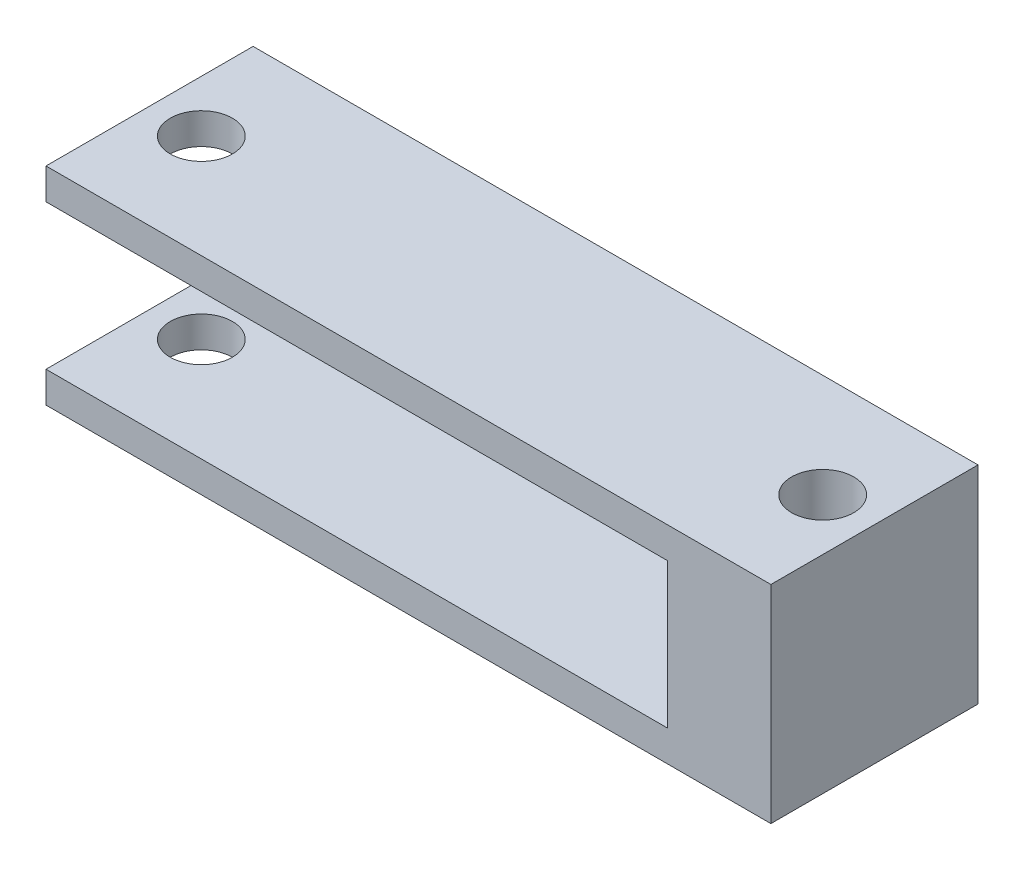
ISO-10303-21;
HEADER;
FILE_DESCRIPTION(('STEP AP214'),'2;1');
FILE_NAME('part.step','',(''),(''),'','','');
FILE_SCHEMA(('AUTOMOTIVE_DESIGN { 1 0 10303 214 1 1 1 1 }'));
ENDSEC;
DATA;
#1=APPLICATION_CONTEXT('core data for automotive mechanical design processes');
#2=APPLICATION_PROTOCOL_DEFINITION('international standard','automotive_design',2000,#1);
#3=PRODUCT_CONTEXT('',#1,'mechanical');
#4=PRODUCT('Part','Part','',(#3));
#5=PRODUCT_RELATED_PRODUCT_CATEGORY('part','',(#4));
#6=PRODUCT_DEFINITION_FORMATION('','',#4);
#7=PRODUCT_DEFINITION_CONTEXT('part definition',#1,'design');
#8=PRODUCT_DEFINITION('design','',#6,#7);
#9=PRODUCT_DEFINITION_SHAPE('','',#8);
#10=(LENGTH_UNIT() NAMED_UNIT(*) SI_UNIT(.MILLI.,.METRE.));
#11=(NAMED_UNIT(*) PLANE_ANGLE_UNIT() SI_UNIT($,.RADIAN.));
#12=(NAMED_UNIT(*) SI_UNIT($,.STERADIAN.) SOLID_ANGLE_UNIT());
#13=UNCERTAINTY_MEASURE_WITH_UNIT(LENGTH_MEASURE(1.E-05),#10,'distance_accuracy_value','');
#14=(GEOMETRIC_REPRESENTATION_CONTEXT(3) GLOBAL_UNCERTAINTY_ASSIGNED_CONTEXT((#13)) GLOBAL_UNIT_ASSIGNED_CONTEXT((#10,
#11,#12)) REPRESENTATION_CONTEXT('',''));
#15=CARTESIAN_POINT('',(0.,0.,0.));
#16=DIRECTION('',(0.,0.,1.));
#17=DIRECTION('',(1.,0.,0.));
#18=AXIS2_PLACEMENT_3D('',#15,#16,#17);
#19=CARTESIAN_POINT('',(-17.5,10.,-5.));
#20=DIRECTION('',(1.,0.,0.));
#21=DIRECTION('',(0.,0.,-1.));
#22=AXIS2_PLACEMENT_3D('',#19,#20,#21);
#23=PLANE('',#22);
#24=DIRECTION('',(0.,-1.,0.));
#25=VECTOR('',#24,1.);
#26=CARTESIAN_POINT('',(-17.5,10.,-5.));
#27=LINE('',#26,#25);
#28=CARTESIAN_POINT('',(-17.5,10.,-5.));
#29=VERTEX_POINT('',#28);
#30=CARTESIAN_POINT('',(-17.5,8.5,-5.));
#31=VERTEX_POINT('',#30);
#32=EDGE_CURVE('E55',#29,#31,#27,.T.);
#33=ORIENTED_EDGE('',*,*,#32,.T.);
#34=DIRECTION('',(0.,0.,1.));
#35=VECTOR('',#34,1.);
#36=CARTESIAN_POINT('',(-17.5,8.5,-5.));
#37=LINE('',#36,#35);
#38=CARTESIAN_POINT('',(-17.5,8.5,5.));
#39=VERTEX_POINT('',#38);
#40=EDGE_CURVE('E161',#31,#39,#37,.T.);
#41=ORIENTED_EDGE('',*,*,#40,.T.);
#42=DIRECTION('',(0.,-1.,0.));
#43=VECTOR('',#42,1.);
#44=CARTESIAN_POINT('',(-17.5,10.,5.));
#45=LINE('',#44,#43);
#46=CARTESIAN_POINT('',(-17.5,10.,5.));
#47=VERTEX_POINT('',#46);
#48=EDGE_CURVE('E208',#47,#39,#45,.T.);
#49=ORIENTED_EDGE('',*,*,#48,.F.);
#50=DIRECTION('',(0.,0.,1.));
#51=VECTOR('',#50,1.);
#52=CARTESIAN_POINT('',(-17.5,10.,-5.));
#53=LINE('',#52,#51);
#54=EDGE_CURVE('E187',#29,#47,#53,.T.);
#55=ORIENTED_EDGE('',*,*,#54,.F.);
#56=EDGE_LOOP('',(#33,#41,#49,#55));
#57=FACE_BOUND('',#56,.T.);
#58=ADVANCED_FACE('F45',(#57),#23,.F.);
#59=CARTESIAN_POINT('',(-15.,10.,0.));
#60=DIRECTION('',(0.,-1.,0.));
#61=DIRECTION('',(0.,0.,-1.));
#62=AXIS2_PLACEMENT_3D('',#59,#60,#61);
#63=CYLINDRICAL_SURFACE('',#62,1.5);
#64=CARTESIAN_POINT('',(-15.,8.5,0.));
#65=DIRECTION('',(0.,1.,0.));
#66=DIRECTION('',(-1.,0.,0.));
#67=AXIS2_PLACEMENT_3D('',#64,#65,#66);
#68=CIRCLE('',#67,1.5);
#69=CARTESIAN_POINT('',(-16.5,8.5,0.));
#70=VERTEX_POINT('',#69);
#71=EDGE_CURVE('E49',#70,#70,#68,.T.);
#72=ORIENTED_EDGE('',*,*,#71,.F.);
#73=EDGE_LOOP('',(#72));
#74=FACE_BOUND('',#73,.T.);
#75=CARTESIAN_POINT('',(-15.,10.,0.));
#76=DIRECTION('',(0.,1.,0.));
#77=DIRECTION('',(0.,0.,1.));
#78=AXIS2_PLACEMENT_3D('',#75,#76,#77);
#79=CIRCLE('',#78,1.5);
#80=CARTESIAN_POINT('',(-15.,10.,1.5));
#81=VERTEX_POINT('',#80);
#82=EDGE_CURVE('E174',#81,#81,#79,.T.);
#83=ORIENTED_EDGE('',*,*,#82,.T.);
#84=EDGE_LOOP('',(#83));
#85=FACE_BOUND('',#84,.T.);
#86=ADVANCED_FACE('F225',(#74,#85),#63,.F.);
#87=CARTESIAN_POINT('',(0.,10.,0.));
#88=DIRECTION('',(0.,1.,0.));
#89=DIRECTION('',(0.,0.,1.));
#90=AXIS2_PLACEMENT_3D('',#87,#88,#89);
#91=PLANE('',#90);
#92=ORIENTED_EDGE('',*,*,#82,.F.);
#93=EDGE_LOOP('',(#92));
#94=FACE_BOUND('',#93,.T.);
#95=DIRECTION('',(0.,0.,-1.));
#96=VECTOR('',#95,1.);
#97=CARTESIAN_POINT('',(17.5,10.,-5.));
#98=LINE('',#97,#96);
#99=CARTESIAN_POINT('',(17.5,10.,5.));
#100=VERTEX_POINT('',#99);
#101=CARTESIAN_POINT('',(17.5,10.,-5.));
#102=VERTEX_POINT('',#101);
#103=EDGE_CURVE('E182',#100,#102,#98,.T.);
#104=ORIENTED_EDGE('',*,*,#103,.T.);
#105=DIRECTION('',(-1.,0.,0.));
#106=VECTOR('',#105,1.);
#107=CARTESIAN_POINT('',(-17.5,10.,-5.));
#108=LINE('',#107,#106);
#109=EDGE_CURVE('E99',#102,#29,#108,.T.);
#110=ORIENTED_EDGE('',*,*,#109,.T.);
#111=ORIENTED_EDGE('',*,*,#54,.T.);
#112=DIRECTION('',(1.,0.,0.));
#113=VECTOR('',#112,1.);
#114=CARTESIAN_POINT('',(-17.5,10.,5.));
#115=LINE('',#114,#113);
#116=EDGE_CURVE('E72',#47,#100,#115,.T.);
#117=ORIENTED_EDGE('',*,*,#116,.T.);
#118=EDGE_LOOP('',(#104,#110,#111,#117));
#119=FACE_BOUND('',#118,.T.);
#120=CARTESIAN_POINT('',(15.,10.,0.));
#121=DIRECTION('',(0.,1.,0.));
#122=DIRECTION('',(0.,0.,1.));
#123=AXIS2_PLACEMENT_3D('',#120,#121,#122);
#124=CIRCLE('',#123,1.5);
#125=CARTESIAN_POINT('',(15.,10.,1.5));
#126=VERTEX_POINT('',#125);
#127=EDGE_CURVE('E166',#126,#126,#124,.T.);
#128=ORIENTED_EDGE('',*,*,#127,.F.);
#129=EDGE_LOOP('',(#128));
#130=FACE_BOUND('',#129,.T.);
#131=ADVANCED_FACE('F231',(#94,#119,#130),#91,.T.);
#132=CARTESIAN_POINT('',(0.,0.,0.));
#133=DIRECTION('',(0.,1.,0.));
#134=DIRECTION('',(0.,0.,1.));
#135=AXIS2_PLACEMENT_3D('',#132,#133,#134);
#136=PLANE('',#135);
#137=DIRECTION('',(0.,0.,-1.));
#138=VECTOR('',#137,1.);
#139=CARTESIAN_POINT('',(17.5,0.,-5.));
#140=LINE('',#139,#138);
#141=CARTESIAN_POINT('',(17.5,0.,5.));
#142=VERTEX_POINT('',#141);
#143=CARTESIAN_POINT('',(17.5,0.,-5.));
#144=VERTEX_POINT('',#143);
#145=EDGE_CURVE('E178',#142,#144,#140,.T.);
#146=ORIENTED_EDGE('',*,*,#145,.F.);
#147=DIRECTION('',(1.,0.,0.));
#148=VECTOR('',#147,1.);
#149=CARTESIAN_POINT('',(-17.5,0.,5.));
#150=LINE('',#149,#148);
#151=CARTESIAN_POINT('',(-17.5,0.,5.));
#152=VERTEX_POINT('',#151);
#153=EDGE_CURVE('E92',#152,#142,#150,.T.);
#154=ORIENTED_EDGE('',*,*,#153,.F.);
#155=DIRECTION('',(0.,0.,1.));
#156=VECTOR('',#155,1.);
#157=CARTESIAN_POINT('',(-17.5,0.,-5.));
#158=LINE('',#157,#156);
#159=CARTESIAN_POINT('',(-17.5,0.,-5.));
#160=VERTEX_POINT('',#159);
#161=EDGE_CURVE('E199',#160,#152,#158,.T.);
#162=ORIENTED_EDGE('',*,*,#161,.F.);
#163=DIRECTION('',(-1.,0.,0.));
#164=VECTOR('',#163,1.);
#165=CARTESIAN_POINT('',(-17.5,0.,-5.));
#166=LINE('',#165,#164);
#167=EDGE_CURVE('E196',#144,#160,#166,.T.);
#168=ORIENTED_EDGE('',*,*,#167,.F.);
#169=EDGE_LOOP('',(#146,#154,#162,#168));
#170=FACE_BOUND('',#169,.T.);
#171=CARTESIAN_POINT('',(-15.,0.,0.));
#172=DIRECTION('',(0.,1.,0.));
#173=DIRECTION('',(0.,0.,1.));
#174=AXIS2_PLACEMENT_3D('',#171,#172,#173);
#175=CIRCLE('',#174,1.5);
#176=CARTESIAN_POINT('',(-15.,0.,1.5));
#177=VERTEX_POINT('',#176);
#178=EDGE_CURVE('E170',#177,#177,#175,.T.);
#179=ORIENTED_EDGE('',*,*,#178,.T.);
#180=EDGE_LOOP('',(#179));
#181=FACE_BOUND('',#180,.T.);
#182=CARTESIAN_POINT('',(15.,0.,0.));
#183=DIRECTION('',(0.,1.,0.));
#184=DIRECTION('',(0.,0.,1.));
#185=AXIS2_PLACEMENT_3D('',#182,#183,#184);
#186=CIRCLE('',#185,1.5);
#187=CARTESIAN_POINT('',(15.,0.,1.5));
#188=VERTEX_POINT('',#187);
#189=EDGE_CURVE('E165',#188,#188,#186,.T.);
#190=ORIENTED_EDGE('',*,*,#189,.T.);
#191=EDGE_LOOP('',(#190));
#192=FACE_BOUND('',#191,.T.);
#193=ADVANCED_FACE('F228',(#170,#181,#192),#136,.F.);
#194=CARTESIAN_POINT('',(17.5,10.,-5.));
#195=DIRECTION('',(-1.,0.,0.));
#196=DIRECTION('',(0.,0.,1.));
#197=AXIS2_PLACEMENT_3D('',#194,#195,#196);
#198=PLANE('',#197);
#199=ORIENTED_EDGE('',*,*,#145,.T.);
#200=DIRECTION('',(0.,-1.,0.));
#201=VECTOR('',#200,1.);
#202=CARTESIAN_POINT('',(17.5,10.,-5.));
#203=LINE('',#202,#201);
#204=EDGE_CURVE('E11',#102,#144,#203,.T.);
#205=ORIENTED_EDGE('',*,*,#204,.F.);
#206=ORIENTED_EDGE('',*,*,#103,.F.);
#207=DIRECTION('',(0.,-1.,0.));
#208=VECTOR('',#207,1.);
#209=CARTESIAN_POINT('',(17.5,10.,5.));
#210=LINE('',#209,#208);
#211=EDGE_CURVE('E192',#100,#142,#210,.T.);
#212=ORIENTED_EDGE('',*,*,#211,.T.);
#213=EDGE_LOOP('',(#199,#205,#206,#212));
#214=FACE_BOUND('',#213,.T.);
#215=ADVANCED_FACE('F47',(#214),#198,.F.);
#216=CARTESIAN_POINT('',(-17.5,10.,-5.));
#217=DIRECTION('',(0.,0.,1.));
#218=DIRECTION('',(1.,0.,0.));
#219=AXIS2_PLACEMENT_3D('',#216,#217,#218);
#220=PLANE('',#219);
#221=DIRECTION('',(0.,1.,0.));
#222=VECTOR('',#221,1.);
#223=CARTESIAN_POINT('',(12.5,8.5,-5.));
#224=LINE('',#223,#222);
#225=CARTESIAN_POINT('',(12.5,1.50000000000001,-5.));
#226=VERTEX_POINT('',#225);
#227=CARTESIAN_POINT('',(12.5,8.5,-5.));
#228=VERTEX_POINT('',#227);
#229=EDGE_CURVE('E133',#226,#228,#224,.T.);
#230=ORIENTED_EDGE('',*,*,#229,.T.);
#231=DIRECTION('',(-1.,0.,0.));
#232=VECTOR('',#231,1.);
#233=CARTESIAN_POINT('',(12.5,8.5,-5.));
#234=LINE('',#233,#232);
#235=EDGE_CURVE('E130',#228,#31,#234,.T.);
#236=ORIENTED_EDGE('',*,*,#235,.T.);
#237=ORIENTED_EDGE('',*,*,#32,.F.);
#238=ORIENTED_EDGE('',*,*,#109,.F.);
#239=ORIENTED_EDGE('',*,*,#204,.T.);
#240=ORIENTED_EDGE('',*,*,#167,.T.);
#241=CARTESIAN_POINT('',(-17.5,1.5,-5.));
#242=VERTEX_POINT('',#241);
#243=EDGE_CURVE('E142',#242,#160,#27,.T.);
#244=ORIENTED_EDGE('',*,*,#243,.F.);
#245=DIRECTION('',(1.,0.,0.));
#246=VECTOR('',#245,1.);
#247=CARTESIAN_POINT('',(12.5,1.50000000000001,-5.));
#248=LINE('',#247,#246);
#249=EDGE_CURVE('E123',#242,#226,#248,.T.);
#250=ORIENTED_EDGE('',*,*,#249,.T.);
#251=EDGE_LOOP('',(#230,#236,#237,#238,#239,#240,#244,#250));
#252=FACE_BOUND('',#251,.T.);
#253=ADVANCED_FACE('F140',(#252),#220,.F.);
#254=CARTESIAN_POINT('',(-17.5,1.5,5.));
#255=VERTEX_POINT('',#254);
#256=EDGE_CURVE('E207',#255,#152,#45,.T.);
#257=ORIENTED_EDGE('',*,*,#256,.F.);
#258=DIRECTION('',(0.,0.,-1.));
#259=VECTOR('',#258,1.);
#260=CARTESIAN_POINT('',(-17.5,1.5,-5.));
#261=LINE('',#260,#259);
#262=EDGE_CURVE('E63',#255,#242,#261,.T.);
#263=ORIENTED_EDGE('',*,*,#262,.T.);
#264=ORIENTED_EDGE('',*,*,#243,.T.);
#265=ORIENTED_EDGE('',*,*,#161,.T.);
#266=EDGE_LOOP('',(#257,#263,#264,#265));
#267=FACE_BOUND('',#266,.T.);
#268=ADVANCED_FACE('F250',(#267),#23,.F.);
#269=CARTESIAN_POINT('',(-17.5,10.,5.));
#270=DIRECTION('',(0.,0.,-1.));
#271=DIRECTION('',(-1.,0.,0.));
#272=AXIS2_PLACEMENT_3D('',#269,#270,#271);
#273=PLANE('',#272);
#274=ORIENTED_EDGE('',*,*,#48,.T.);
#275=DIRECTION('',(-1.,0.,0.));
#276=VECTOR('',#275,1.);
#277=CARTESIAN_POINT('',(12.5,8.5,5.));
#278=LINE('',#277,#276);
#279=CARTESIAN_POINT('',(12.5,8.5,5.));
#280=VERTEX_POINT('',#279);
#281=EDGE_CURVE('E144',#280,#39,#278,.T.);
#282=ORIENTED_EDGE('',*,*,#281,.F.);
#283=DIRECTION('',(0.,1.,0.));
#284=VECTOR('',#283,1.);
#285=CARTESIAN_POINT('',(12.5,8.5,5.));
#286=LINE('',#285,#284);
#287=CARTESIAN_POINT('',(12.5,1.50000000000001,5.));
#288=VERTEX_POINT('',#287);
#289=EDGE_CURVE('E147',#288,#280,#286,.T.);
#290=ORIENTED_EDGE('',*,*,#289,.F.);
#291=DIRECTION('',(1.,0.,0.));
#292=VECTOR('',#291,1.);
#293=CARTESIAN_POINT('',(12.5,1.50000000000001,5.));
#294=LINE('',#293,#292);
#295=EDGE_CURVE('E124',#255,#288,#294,.T.);
#296=ORIENTED_EDGE('',*,*,#295,.F.);
#297=ORIENTED_EDGE('',*,*,#256,.T.);
#298=ORIENTED_EDGE('',*,*,#153,.T.);
#299=ORIENTED_EDGE('',*,*,#211,.F.);
#300=ORIENTED_EDGE('',*,*,#116,.F.);
#301=EDGE_LOOP('',(#274,#282,#290,#296,#297,#298,#299,#300));
#302=FACE_BOUND('',#301,.T.);
#303=ADVANCED_FACE('F223',(#302),#273,.F.);
#304=CARTESIAN_POINT('',(-15.,1.5,0.));
#305=DIRECTION('',(0.,-1.,0.));
#306=DIRECTION('',(1.,0.,0.));
#307=AXIS2_PLACEMENT_3D('',#304,#305,#306);
#308=CIRCLE('',#307,1.5);
#309=CARTESIAN_POINT('',(-13.5,1.5,0.));
#310=VERTEX_POINT('',#309);
#311=EDGE_CURVE('E157',#310,#310,#308,.T.);
#312=ORIENTED_EDGE('',*,*,#311,.F.);
#313=EDGE_LOOP('',(#312));
#314=FACE_BOUND('',#313,.T.);
#315=ORIENTED_EDGE('',*,*,#178,.F.);
#316=EDGE_LOOP('',(#315));
#317=FACE_BOUND('',#316,.T.);
#318=ADVANCED_FACE('F219',(#314,#317),#63,.F.);
#319=CARTESIAN_POINT('',(15.,10.,0.));
#320=DIRECTION('',(0.,-1.,0.));
#321=DIRECTION('',(0.,0.,-1.));
#322=AXIS2_PLACEMENT_3D('',#319,#320,#321);
#323=CYLINDRICAL_SURFACE('',#322,1.5);
#324=ORIENTED_EDGE('',*,*,#127,.T.);
#325=EDGE_LOOP('',(#324));
#326=FACE_BOUND('',#325,.T.);
#327=ORIENTED_EDGE('',*,*,#189,.F.);
#328=EDGE_LOOP('',(#327));
#329=FACE_BOUND('',#328,.T.);
#330=ADVANCED_FACE('F222',(#326,#329),#323,.F.);
#331=CARTESIAN_POINT('',(12.5,8.5,-5.));
#332=DIRECTION('',(0.,1.,0.));
#333=DIRECTION('',(-1.,0.,0.));
#334=AXIS2_PLACEMENT_3D('',#331,#332,#333);
#335=PLANE('',#334);
#336=ORIENTED_EDGE('',*,*,#71,.T.);
#337=EDGE_LOOP('',(#336));
#338=FACE_BOUND('',#337,.T.);
#339=ORIENTED_EDGE('',*,*,#235,.F.);
#340=DIRECTION('',(0.,0.,1.));
#341=VECTOR('',#340,1.);
#342=CARTESIAN_POINT('',(12.5,8.5,-5.));
#343=LINE('',#342,#341);
#344=EDGE_CURVE('E129',#228,#280,#343,.T.);
#345=ORIENTED_EDGE('',*,*,#344,.T.);
#346=ORIENTED_EDGE('',*,*,#281,.T.);
#347=ORIENTED_EDGE('',*,*,#40,.F.);
#348=EDGE_LOOP('',(#339,#345,#346,#347));
#349=FACE_BOUND('',#348,.T.);
#350=ADVANCED_FACE('F237',(#338,#349),#335,.F.);
#351=CARTESIAN_POINT('',(12.5,1.50000000000001,-5.));
#352=DIRECTION('',(0.,-1.,0.));
#353=DIRECTION('',(1.,0.,0.));
#354=AXIS2_PLACEMENT_3D('',#351,#352,#353);
#355=PLANE('',#354);
#356=ORIENTED_EDGE('',*,*,#311,.T.);
#357=EDGE_LOOP('',(#356));
#358=FACE_BOUND('',#357,.T.);
#359=ORIENTED_EDGE('',*,*,#295,.T.);
#360=DIRECTION('',(0.,0.,1.));
#361=VECTOR('',#360,1.);
#362=CARTESIAN_POINT('',(12.5,1.50000000000001,-5.));
#363=LINE('',#362,#361);
#364=EDGE_CURVE('E119',#226,#288,#363,.T.);
#365=ORIENTED_EDGE('',*,*,#364,.F.);
#366=ORIENTED_EDGE('',*,*,#249,.F.);
#367=ORIENTED_EDGE('',*,*,#262,.F.);
#368=EDGE_LOOP('',(#359,#365,#366,#367));
#369=FACE_BOUND('',#368,.T.);
#370=ADVANCED_FACE('F121',(#358,#369),#355,.F.);
#371=CARTESIAN_POINT('',(12.5,8.5,-5.));
#372=DIRECTION('',(1.,0.,0.));
#373=DIRECTION('',(0.,1.,0.));
#374=AXIS2_PLACEMENT_3D('',#371,#372,#373);
#375=PLANE('',#374);
#376=ORIENTED_EDGE('',*,*,#289,.T.);
#377=ORIENTED_EDGE('',*,*,#344,.F.);
#378=ORIENTED_EDGE('',*,*,#229,.F.);
#379=ORIENTED_EDGE('',*,*,#364,.T.);
#380=EDGE_LOOP('',(#376,#377,#378,#379));
#381=FACE_BOUND('',#380,.T.);
#382=ADVANCED_FACE('F134',(#381),#375,.F.);
#383=CLOSED_SHELL('',(#58,#86,#131,#193,#215,#253,#268,#303,#318,#330,#350,#370,#382));
#384=MANIFOLD_SOLID_BREP('B2',#383);
#385=ADVANCED_BREP_SHAPE_REPRESENTATION('',(#18,#384),#14);
#386=SHAPE_DEFINITION_REPRESENTATION(#9,#385);
ENDSEC;
END-ISO-10303-21;
